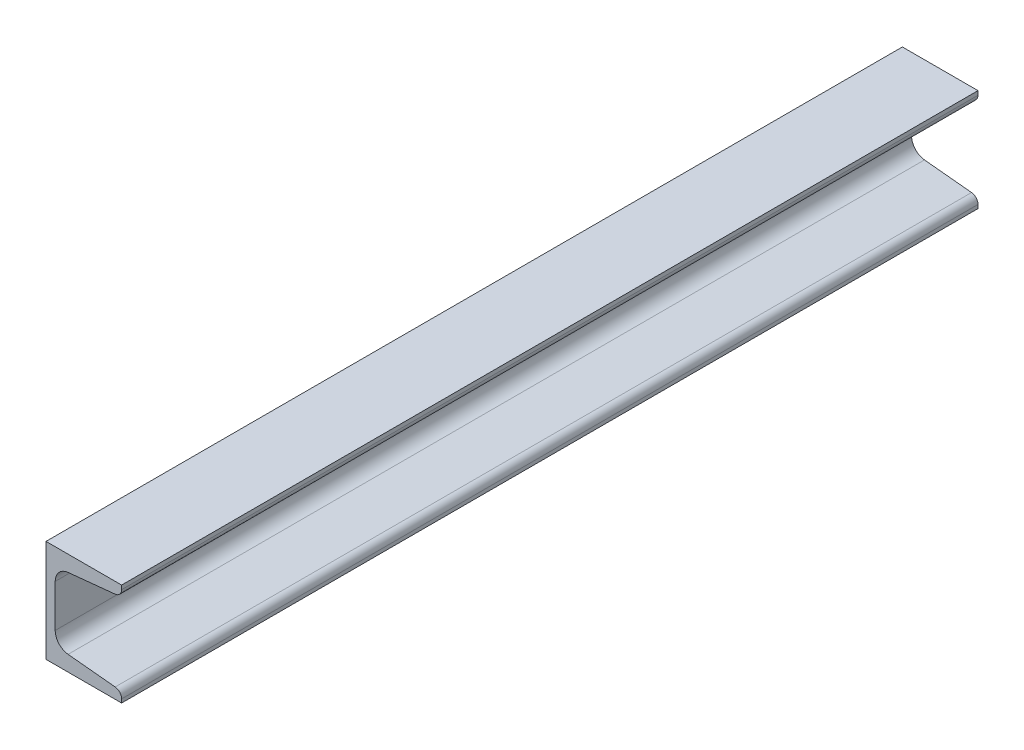
ISO-10303-21;
HEADER;
FILE_DESCRIPTION(('STEP AP214'),'2;1');
FILE_NAME('part.step','',(''),(''),'','','');
FILE_SCHEMA(('AUTOMOTIVE_DESIGN { 1 0 10303 214 1 1 1 1 }'));
ENDSEC;
DATA;
#1=APPLICATION_CONTEXT('core data for automotive mechanical design processes');
#2=APPLICATION_PROTOCOL_DEFINITION('international standard','automotive_design',2000,#1);
#3=PRODUCT_CONTEXT('',#1,'mechanical');
#4=PRODUCT('Part','Part','',(#3));
#5=PRODUCT_RELATED_PRODUCT_CATEGORY('part','',(#4));
#6=PRODUCT_DEFINITION_FORMATION('','',#4);
#7=PRODUCT_DEFINITION_CONTEXT('part definition',#1,'design');
#8=PRODUCT_DEFINITION('design','',#6,#7);
#9=PRODUCT_DEFINITION_SHAPE('','',#8);
#10=(LENGTH_UNIT() NAMED_UNIT(*) SI_UNIT(.MILLI.,.METRE.));
#11=(NAMED_UNIT(*) PLANE_ANGLE_UNIT() SI_UNIT($,.RADIAN.));
#12=(NAMED_UNIT(*) SI_UNIT($,.STERADIAN.) SOLID_ANGLE_UNIT());
#13=UNCERTAINTY_MEASURE_WITH_UNIT(LENGTH_MEASURE(1.E-05),#10,'distance_accuracy_value','');
#14=(GEOMETRIC_REPRESENTATION_CONTEXT(3) GLOBAL_UNCERTAINTY_ASSIGNED_CONTEXT((#13)) GLOBAL_UNIT_ASSIGNED_CONTEXT((#10,
#11,#12)) REPRESENTATION_CONTEXT('',''));
#15=CARTESIAN_POINT('',(0.,0.,0.));
#16=DIRECTION('',(0.,0.,1.));
#17=DIRECTION('',(1.,0.,0.));
#18=AXIS2_PLACEMENT_3D('',#15,#16,#17);
#19=CARTESIAN_POINT('',(0.,0.,419.));
#20=DIRECTION('',(0.,1.,0.));
#21=DIRECTION('',(0.,0.,1.));
#22=AXIS2_PLACEMENT_3D('',#19,#20,#21);
#23=PLANE('',#22);
#24=DIRECTION('',(1.,0.,0.));
#25=VECTOR('',#24,1.);
#26=CARTESIAN_POINT('',(0.,0.,0.));
#27=LINE('',#26,#25);
#28=CARTESIAN_POINT('',(0.,0.,0.));
#29=VERTEX_POINT('',#28);
#30=CARTESIAN_POINT('',(37.,0.,0.));
#31=VERTEX_POINT('',#30);
#32=EDGE_CURVE('E156',#29,#31,#27,.T.);
#33=ORIENTED_EDGE('',*,*,#32,.T.);
#34=DIRECTION('',(0.,0.,-1.));
#35=VECTOR('',#34,1.);
#36=CARTESIAN_POINT('',(37.,0.,419.));
#37=LINE('',#36,#35);
#38=CARTESIAN_POINT('',(37.,0.,419.));
#39=VERTEX_POINT('',#38);
#40=EDGE_CURVE('E11',#39,#31,#37,.T.);
#41=ORIENTED_EDGE('',*,*,#40,.F.);
#42=DIRECTION('',(1.,0.,0.));
#43=VECTOR('',#42,1.);
#44=CARTESIAN_POINT('',(0.,0.,419.));
#45=LINE('',#44,#43);
#46=CARTESIAN_POINT('',(0.,0.,419.));
#47=VERTEX_POINT('',#46);
#48=EDGE_CURVE('E178',#47,#39,#45,.T.);
#49=ORIENTED_EDGE('',*,*,#48,.F.);
#50=DIRECTION('',(0.,0.,-1.));
#51=VECTOR('',#50,1.);
#52=CARTESIAN_POINT('',(0.,0.,419.));
#53=LINE('',#52,#51);
#54=EDGE_CURVE('E152',#47,#29,#53,.T.);
#55=ORIENTED_EDGE('',*,*,#54,.T.);
#56=EDGE_LOOP('',(#33,#41,#49,#55));
#57=FACE_BOUND('',#56,.T.);
#58=ADVANCED_FACE('F36',(#57),#23,.F.);
#59=CARTESIAN_POINT('',(37.,0.,419.));
#60=DIRECTION('',(-1.,0.,0.));
#61=DIRECTION('',(0.,0.,1.));
#62=AXIS2_PLACEMENT_3D('',#59,#60,#61);
#63=PLANE('',#62);
#64=DIRECTION('',(0.,1.,0.));
#65=VECTOR('',#64,1.);
#66=CARTESIAN_POINT('',(37.,0.,0.));
#67=LINE('',#66,#65);
#68=CARTESIAN_POINT('',(37.,1.75754353260767,0.));
#69=VERTEX_POINT('',#68);
#70=EDGE_CURVE('E159',#31,#69,#67,.T.);
#71=ORIENTED_EDGE('',*,*,#70,.T.);
#72=DIRECTION('',(0.,0.,-1.));
#73=VECTOR('',#72,1.);
#74=CARTESIAN_POINT('',(37.,1.75754353260767,419.));
#75=LINE('',#74,#73);
#76=CARTESIAN_POINT('',(37.,1.75754353260767,419.));
#77=VERTEX_POINT('',#76);
#78=EDGE_CURVE('E44',#77,#69,#75,.T.);
#79=ORIENTED_EDGE('',*,*,#78,.F.);
#80=DIRECTION('',(0.,1.,0.));
#81=VECTOR('',#80,1.);
#82=CARTESIAN_POINT('',(37.,0.,419.));
#83=LINE('',#82,#81);
#84=EDGE_CURVE('E107',#39,#77,#83,.T.);
#85=ORIENTED_EDGE('',*,*,#84,.F.);
#86=ORIENTED_EDGE('',*,*,#40,.T.);
#87=EDGE_LOOP('',(#71,#79,#85,#86));
#88=FACE_BOUND('',#87,.T.);
#89=ADVANCED_FACE('F256',(#88),#63,.F.);
#90=CARTESIAN_POINT('',(33.5,1.75754353260769,419.));
#91=DIRECTION('',(0.,0.,-1.));
#92=DIRECTION('',(-1.,0.,0.));
#93=AXIS2_PLACEMENT_3D('',#90,#91,#92);
#94=CYLINDRICAL_SURFACE('',#93,3.5);
#95=CARTESIAN_POINT('',(33.5,1.75754353260769,0.));
#96=DIRECTION('',(0.,0.,1.));
#97=DIRECTION('',(1.,0.,0.));
#98=AXIS2_PLACEMENT_3D('',#95,#96,#97);
#99=CIRCLE('',#98,3.5);
#100=CARTESIAN_POINT('',(33.8482630165735,5.24017369834266,0.));
#101=VERTEX_POINT('',#100);
#102=EDGE_CURVE('E161',#69,#101,#99,.T.);
#103=ORIENTED_EDGE('',*,*,#102,.T.);
#104=DIRECTION('',(0.,0.,-1.));
#105=VECTOR('',#104,1.);
#106=CARTESIAN_POINT('',(33.8482630165735,5.24017369834266,419.));
#107=LINE('',#106,#105);
#108=CARTESIAN_POINT('',(33.8482630165735,5.24017369834266,419.));
#109=VERTEX_POINT('',#108);
#110=EDGE_CURVE('E197',#109,#101,#107,.T.);
#111=ORIENTED_EDGE('',*,*,#110,.F.);
#112=CARTESIAN_POINT('',(33.5,1.75754353260769,419.));
#113=DIRECTION('',(0.,0.,1.));
#114=DIRECTION('',(1.,0.,0.));
#115=AXIS2_PLACEMENT_3D('',#112,#113,#114);
#116=CIRCLE('',#115,3.5);
#117=EDGE_CURVE('E205',#77,#109,#116,.T.);
#118=ORIENTED_EDGE('',*,*,#117,.F.);
#119=ORIENTED_EDGE('',*,*,#78,.T.);
#120=EDGE_LOOP('',(#103,#111,#118,#119));
#121=FACE_BOUND('',#120,.T.);
#122=ADVANCED_FACE('F203',(#121),#94,.T.);
#123=CARTESIAN_POINT('',(10.8034739668531,7.5446526033147,419.));
#124=DIRECTION('',(-0.0995037190209989,-0.995037190209989,0.));
#125=DIRECTION('',(0.995037190209989,-0.0995037190209989,0.));
#126=AXIS2_PLACEMENT_3D('',#123,#124,#125);
#127=PLANE('',#126);
#128=DIRECTION('',(-0.995037190209989,0.0995037190209989,0.));
#129=VECTOR('',#128,1.);
#130=CARTESIAN_POINT('',(10.8034739668531,7.5446526033147,0.));
#131=LINE('',#130,#129);
#132=CARTESIAN_POINT('',(10.8034739668531,7.5446526033147,0.));
#133=VERTEX_POINT('',#132);
#134=EDGE_CURVE('E163',#101,#133,#131,.T.);
#135=ORIENTED_EDGE('',*,*,#134,.T.);
#136=DIRECTION('',(0.,0.,-1.));
#137=VECTOR('',#136,1.);
#138=CARTESIAN_POINT('',(10.8034739668531,7.5446526033147,419.));
#139=LINE('',#138,#137);
#140=CARTESIAN_POINT('',(10.8034739668531,7.5446526033147,419.));
#141=VERTEX_POINT('',#140);
#142=EDGE_CURVE('E194',#141,#133,#139,.T.);
#143=ORIENTED_EDGE('',*,*,#142,.F.);
#144=DIRECTION('',(-0.995037190209989,0.0995037190209989,0.));
#145=VECTOR('',#144,1.);
#146=CARTESIAN_POINT('',(10.8034739668531,7.5446526033147,419.));
#147=LINE('',#146,#145);
#148=EDGE_CURVE('E223',#109,#141,#147,.T.);
#149=ORIENTED_EDGE('',*,*,#148,.F.);
#150=ORIENTED_EDGE('',*,*,#110,.T.);
#151=EDGE_LOOP('',(#135,#143,#149,#150));
#152=FACE_BOUND('',#151,.T.);
#153=ADVANCED_FACE('F214',(#152),#127,.F.);
#154=CARTESIAN_POINT('',(11.5,14.5099129347846,419.));
#155=DIRECTION('',(0.,0.,-1.));
#156=DIRECTION('',(-1.,0.,0.));
#157=AXIS2_PLACEMENT_3D('',#154,#155,#156);
#158=CYLINDRICAL_SURFACE('',#157,7.);
#159=CARTESIAN_POINT('',(11.5,14.5099129347846,0.));
#160=DIRECTION('',(0.,0.,-1.));
#161=DIRECTION('',(1.,0.,0.));
#162=AXIS2_PLACEMENT_3D('',#159,#160,#161);
#163=CIRCLE('',#162,7.);
#164=CARTESIAN_POINT('',(4.5,14.5099129347847,0.));
#165=VERTEX_POINT('',#164);
#166=EDGE_CURVE('E165',#133,#165,#163,.T.);
#167=ORIENTED_EDGE('',*,*,#166,.T.);
#168=DIRECTION('',(0.,0.,-1.));
#169=VECTOR('',#168,1.);
#170=CARTESIAN_POINT('',(4.5,14.5099129347847,419.));
#171=LINE('',#170,#169);
#172=CARTESIAN_POINT('',(4.5,14.5099129347847,419.));
#173=VERTEX_POINT('',#172);
#174=EDGE_CURVE('E191',#173,#165,#171,.T.);
#175=ORIENTED_EDGE('',*,*,#174,.F.);
#176=CARTESIAN_POINT('',(11.5,14.5099129347846,419.));
#177=DIRECTION('',(0.,0.,-1.));
#178=DIRECTION('',(1.,0.,0.));
#179=AXIS2_PLACEMENT_3D('',#176,#177,#178);
#180=CIRCLE('',#179,7.);
#181=EDGE_CURVE('E220',#141,#173,#180,.T.);
#182=ORIENTED_EDGE('',*,*,#181,.F.);
#183=ORIENTED_EDGE('',*,*,#142,.T.);
#184=EDGE_LOOP('',(#167,#175,#182,#183));
#185=FACE_BOUND('',#184,.T.);
#186=ADVANCED_FACE('F218',(#185),#158,.F.);
#187=CARTESIAN_POINT('',(4.5,14.5099129347847,419.));
#188=DIRECTION('',(-1.,0.,0.));
#189=DIRECTION('',(0.,-1.,0.));
#190=AXIS2_PLACEMENT_3D('',#187,#188,#189);
#191=PLANE('',#190);
#192=DIRECTION('',(0.,1.,0.));
#193=VECTOR('',#192,1.);
#194=CARTESIAN_POINT('',(4.5,14.5099129347847,0.));
#195=LINE('',#194,#193);
#196=CARTESIAN_POINT('',(4.5,35.2876429963102,0.));
#197=VERTEX_POINT('',#196);
#198=EDGE_CURVE('E167',#165,#197,#195,.T.);
#199=ORIENTED_EDGE('',*,*,#198,.T.);
#200=DIRECTION('',(0.,0.,-1.));
#201=VECTOR('',#200,1.);
#202=CARTESIAN_POINT('',(4.5,35.2876429963102,419.));
#203=LINE('',#202,#201);
#204=CARTESIAN_POINT('',(4.5,35.2876429963102,419.));
#205=VERTEX_POINT('',#204);
#206=EDGE_CURVE('E188',#205,#197,#203,.T.);
#207=ORIENTED_EDGE('',*,*,#206,.F.);
#208=DIRECTION('',(0.,1.,0.));
#209=VECTOR('',#208,1.);
#210=CARTESIAN_POINT('',(4.5,14.5099129347847,419.));
#211=LINE('',#210,#209);
#212=EDGE_CURVE('E222',#173,#205,#211,.T.);
#213=ORIENTED_EDGE('',*,*,#212,.F.);
#214=ORIENTED_EDGE('',*,*,#174,.T.);
#215=EDGE_LOOP('',(#199,#207,#213,#214));
#216=FACE_BOUND('',#215,.T.);
#217=ADVANCED_FACE('F269',(#216),#191,.F.);
#218=CARTESIAN_POINT('',(11.5,35.2876429963103,419.));
#219=DIRECTION('',(0.,0.,-1.));
#220=DIRECTION('',(-1.,0.,0.));
#221=AXIS2_PLACEMENT_3D('',#218,#219,#220);
#222=CYLINDRICAL_SURFACE('',#221,7.);
#223=CARTESIAN_POINT('',(11.5,35.2876429963103,0.));
#224=DIRECTION('',(0.,0.,-1.));
#225=DIRECTION('',(1.,0.,0.));
#226=AXIS2_PLACEMENT_3D('',#223,#224,#225);
#227=CIRCLE('',#226,7.);
#228=CARTESIAN_POINT('',(10.803473966853,42.2529033277802,0.));
#229=VERTEX_POINT('',#228);
#230=EDGE_CURVE('E169',#197,#229,#227,.T.);
#231=ORIENTED_EDGE('',*,*,#230,.T.);
#232=DIRECTION('',(0.,0.,-1.));
#233=VECTOR('',#232,1.);
#234=CARTESIAN_POINT('',(10.803473966853,42.2529033277802,419.));
#235=LINE('',#234,#233);
#236=CARTESIAN_POINT('',(10.803473966853,42.2529033277802,419.));
#237=VERTEX_POINT('',#236);
#238=EDGE_CURVE('E185',#237,#229,#235,.T.);
#239=ORIENTED_EDGE('',*,*,#238,.F.);
#240=CARTESIAN_POINT('',(11.5,35.2876429963103,419.));
#241=DIRECTION('',(0.,0.,-1.));
#242=DIRECTION('',(1.,0.,0.));
#243=AXIS2_PLACEMENT_3D('',#240,#241,#242);
#244=CIRCLE('',#243,7.);
#245=EDGE_CURVE('E225',#205,#237,#244,.T.);
#246=ORIENTED_EDGE('',*,*,#245,.F.);
#247=ORIENTED_EDGE('',*,*,#206,.T.);
#248=EDGE_LOOP('',(#231,#239,#246,#247));
#249=FACE_BOUND('',#248,.T.);
#250=ADVANCED_FACE('F272',(#249),#222,.F.);
#251=CARTESIAN_POINT('',(10.803473966853,42.2529033277802,419.));
#252=DIRECTION('',(-0.0995037190209989,0.995037190209989,0.));
#253=DIRECTION('',(-0.995037190209989,-0.0995037190209989,0.));
#254=AXIS2_PLACEMENT_3D('',#251,#252,#253);
#255=PLANE('',#254);
#256=DIRECTION('',(0.995037190209989,0.0995037190209989,0.));
#257=VECTOR('',#256,1.);
#258=CARTESIAN_POINT('',(10.803473966853,42.2529033277802,0.));
#259=LINE('',#258,#257);
#260=CARTESIAN_POINT('',(33.8482630165735,44.5573822327522,0.));
#261=VERTEX_POINT('',#260);
#262=EDGE_CURVE('E171',#229,#261,#259,.T.);
#263=ORIENTED_EDGE('',*,*,#262,.T.);
#264=DIRECTION('',(0.,0.,-1.));
#265=VECTOR('',#264,1.);
#266=CARTESIAN_POINT('',(33.8482630165735,44.5573822327522,419.));
#267=LINE('',#266,#265);
#268=CARTESIAN_POINT('',(33.8482630165735,44.5573822327522,419.));
#269=VERTEX_POINT('',#268);
#270=EDGE_CURVE('E182',#269,#261,#267,.T.);
#271=ORIENTED_EDGE('',*,*,#270,.F.);
#272=DIRECTION('',(0.995037190209989,0.0995037190209989,0.));
#273=VECTOR('',#272,1.);
#274=CARTESIAN_POINT('',(10.803473966853,42.2529033277802,419.));
#275=LINE('',#274,#273);
#276=EDGE_CURVE('E231',#237,#269,#275,.T.);
#277=ORIENTED_EDGE('',*,*,#276,.F.);
#278=ORIENTED_EDGE('',*,*,#238,.T.);
#279=EDGE_LOOP('',(#263,#271,#277,#278));
#280=FACE_BOUND('',#279,.T.);
#281=ADVANCED_FACE('F237',(#280),#255,.F.);
#282=CARTESIAN_POINT('',(33.5,48.0400123984872,419.));
#283=DIRECTION('',(0.,0.,-1.));
#284=DIRECTION('',(-1.,0.,0.));
#285=AXIS2_PLACEMENT_3D('',#282,#283,#284);
#286=CYLINDRICAL_SURFACE('',#285,3.50000000000001);
#287=CARTESIAN_POINT('',(33.5,48.0400123984872,0.));
#288=DIRECTION('',(0.,0.,1.));
#289=DIRECTION('',(1.,0.,0.));
#290=AXIS2_PLACEMENT_3D('',#287,#288,#289);
#291=CIRCLE('',#290,3.50000000000001);
#292=CARTESIAN_POINT('',(37.,48.0400123984872,0.));
#293=VERTEX_POINT('',#292);
#294=EDGE_CURVE('E173',#261,#293,#291,.T.);
#295=ORIENTED_EDGE('',*,*,#294,.T.);
#296=DIRECTION('',(0.,0.,-1.));
#297=VECTOR('',#296,1.);
#298=CARTESIAN_POINT('',(37.,48.0400123984872,419.));
#299=LINE('',#298,#297);
#300=CARTESIAN_POINT('',(37.,48.0400123984872,419.));
#301=VERTEX_POINT('',#300);
#302=EDGE_CURVE('E147',#301,#293,#299,.T.);
#303=ORIENTED_EDGE('',*,*,#302,.F.);
#304=CARTESIAN_POINT('',(33.5,48.0400123984872,419.));
#305=DIRECTION('',(0.,0.,1.));
#306=DIRECTION('',(1.,0.,0.));
#307=AXIS2_PLACEMENT_3D('',#304,#305,#306);
#308=CIRCLE('',#307,3.50000000000001);
#309=EDGE_CURVE('E138',#269,#301,#308,.T.);
#310=ORIENTED_EDGE('',*,*,#309,.F.);
#311=ORIENTED_EDGE('',*,*,#270,.T.);
#312=EDGE_LOOP('',(#295,#303,#310,#311));
#313=FACE_BOUND('',#312,.T.);
#314=ADVANCED_FACE('F241',(#313),#286,.T.);
#315=CARTESIAN_POINT('',(37.,48.0400123984872,419.));
#316=DIRECTION('',(-1.,0.,0.));
#317=DIRECTION('',(0.,0.,1.));
#318=AXIS2_PLACEMENT_3D('',#315,#316,#317);
#319=PLANE('',#318);
#320=DIRECTION('',(0.,1.,0.));
#321=VECTOR('',#320,1.);
#322=CARTESIAN_POINT('',(37.,48.0400123984872,0.));
#323=LINE('',#322,#321);
#324=CARTESIAN_POINT('',(37.,50.,0.));
#325=VERTEX_POINT('',#324);
#326=EDGE_CURVE('E146',#293,#325,#323,.T.);
#327=ORIENTED_EDGE('',*,*,#326,.T.);
#328=DIRECTION('',(0.,0.,-1.));
#329=VECTOR('',#328,1.);
#330=CARTESIAN_POINT('',(37.,50.,419.));
#331=LINE('',#330,#329);
#332=CARTESIAN_POINT('',(37.,50.,419.));
#333=VERTEX_POINT('',#332);
#334=EDGE_CURVE('E143',#333,#325,#331,.T.);
#335=ORIENTED_EDGE('',*,*,#334,.F.);
#336=DIRECTION('',(0.,1.,0.));
#337=VECTOR('',#336,1.);
#338=CARTESIAN_POINT('',(37.,48.0400123984872,419.));
#339=LINE('',#338,#337);
#340=EDGE_CURVE('E132',#301,#333,#339,.T.);
#341=ORIENTED_EDGE('',*,*,#340,.F.);
#342=ORIENTED_EDGE('',*,*,#302,.T.);
#343=EDGE_LOOP('',(#327,#335,#341,#342));
#344=FACE_BOUND('',#343,.T.);
#345=ADVANCED_FACE('F144',(#344),#319,.F.);
#346=CARTESIAN_POINT('',(-1.71512449944288E-13,50.,419.));
#347=DIRECTION('',(0.,-1.,0.));
#348=DIRECTION('',(0.,0.,-1.));
#349=AXIS2_PLACEMENT_3D('',#346,#347,#348);
#350=PLANE('',#349);
#351=DIRECTION('',(-1.,0.,0.));
#352=VECTOR('',#351,1.);
#353=CARTESIAN_POINT('',(-1.71512449944288E-13,50.,0.));
#354=LINE('',#353,#352);
#355=CARTESIAN_POINT('',(-1.71512449944288E-13,50.,0.));
#356=VERTEX_POINT('',#355);
#357=EDGE_CURVE('E93',#325,#356,#354,.T.);
#358=ORIENTED_EDGE('',*,*,#357,.T.);
#359=DIRECTION('',(0.,0.,-1.));
#360=VECTOR('',#359,1.);
#361=CARTESIAN_POINT('',(-1.71512449944288E-13,50.,419.));
#362=LINE('',#361,#360);
#363=CARTESIAN_POINT('',(-1.71512449944288E-13,50.,419.));
#364=VERTEX_POINT('',#363);
#365=EDGE_CURVE('E148',#364,#356,#362,.T.);
#366=ORIENTED_EDGE('',*,*,#365,.F.);
#367=DIRECTION('',(-1.,0.,0.));
#368=VECTOR('',#367,1.);
#369=CARTESIAN_POINT('',(-1.71512449944288E-13,50.,419.));
#370=LINE('',#369,#368);
#371=EDGE_CURVE('E136',#333,#364,#370,.T.);
#372=ORIENTED_EDGE('',*,*,#371,.F.);
#373=ORIENTED_EDGE('',*,*,#334,.T.);
#374=EDGE_LOOP('',(#358,#366,#372,#373));
#375=FACE_BOUND('',#374,.T.);
#376=ADVANCED_FACE('F150',(#375),#350,.F.);
#377=CARTESIAN_POINT('',(0.,0.,419.));
#378=DIRECTION('',(1.,0.,0.));
#379=DIRECTION('',(0.,1.,0.));
#380=AXIS2_PLACEMENT_3D('',#377,#378,#379);
#381=PLANE('',#380);
#382=DIRECTION('',(0.,-1.,0.));
#383=VECTOR('',#382,1.);
#384=CARTESIAN_POINT('',(0.,0.,0.));
#385=LINE('',#384,#383);
#386=EDGE_CURVE('E99',#356,#29,#385,.T.);
#387=ORIENTED_EDGE('',*,*,#386,.T.);
#388=ORIENTED_EDGE('',*,*,#54,.F.);
#389=DIRECTION('',(0.,-1.,0.));
#390=VECTOR('',#389,1.);
#391=CARTESIAN_POINT('',(0.,0.,419.));
#392=LINE('',#391,#390);
#393=EDGE_CURVE('E52',#364,#47,#392,.T.);
#394=ORIENTED_EDGE('',*,*,#393,.F.);
#395=ORIENTED_EDGE('',*,*,#365,.T.);
#396=EDGE_LOOP('',(#387,#388,#394,#395));
#397=FACE_BOUND('',#396,.T.);
#398=ADVANCED_FACE('F245',(#397),#381,.F.);
#399=CARTESIAN_POINT('',(33.5,1.75754353260769,419.));
#400=DIRECTION('',(0.,0.,1.));
#401=DIRECTION('',(1.,0.,0.));
#402=AXIS2_PLACEMENT_3D('',#399,#400,#401);
#403=PLANE('',#402);
#404=ORIENTED_EDGE('',*,*,#48,.T.);
#405=ORIENTED_EDGE('',*,*,#84,.T.);
#406=ORIENTED_EDGE('',*,*,#117,.T.);
#407=ORIENTED_EDGE('',*,*,#148,.T.);
#408=ORIENTED_EDGE('',*,*,#181,.T.);
#409=ORIENTED_EDGE('',*,*,#212,.T.);
#410=ORIENTED_EDGE('',*,*,#245,.T.);
#411=ORIENTED_EDGE('',*,*,#276,.T.);
#412=ORIENTED_EDGE('',*,*,#309,.T.);
#413=ORIENTED_EDGE('',*,*,#340,.T.);
#414=ORIENTED_EDGE('',*,*,#371,.T.);
#415=ORIENTED_EDGE('',*,*,#393,.T.);
#416=EDGE_LOOP('',(#404,#405,#406,#407,#408,#409,#410,#411,#412,#413,#414,#415));
#417=FACE_BOUND('',#416,.T.);
#418=ADVANCED_FACE('F134',(#417),#403,.T.);
#419=CARTESIAN_POINT('',(33.5,1.75754353260769,0.));
#420=DIRECTION('',(0.,0.,1.));
#421=DIRECTION('',(1.,0.,0.));
#422=AXIS2_PLACEMENT_3D('',#419,#420,#421);
#423=PLANE('',#422);
#424=ORIENTED_EDGE('',*,*,#32,.F.);
#425=ORIENTED_EDGE('',*,*,#386,.F.);
#426=ORIENTED_EDGE('',*,*,#357,.F.);
#427=ORIENTED_EDGE('',*,*,#326,.F.);
#428=ORIENTED_EDGE('',*,*,#294,.F.);
#429=ORIENTED_EDGE('',*,*,#262,.F.);
#430=ORIENTED_EDGE('',*,*,#230,.F.);
#431=ORIENTED_EDGE('',*,*,#198,.F.);
#432=ORIENTED_EDGE('',*,*,#166,.F.);
#433=ORIENTED_EDGE('',*,*,#134,.F.);
#434=ORIENTED_EDGE('',*,*,#102,.F.);
#435=ORIENTED_EDGE('',*,*,#70,.F.);
#436=EDGE_LOOP('',(#424,#425,#426,#427,#428,#429,#430,#431,#432,#433,#434,#435));
#437=FACE_BOUND('',#436,.T.);
#438=ADVANCED_FACE('F209',(#437),#423,.F.);
#439=CLOSED_SHELL('',(#58,#89,#122,#153,#186,#217,#250,#281,#314,#345,#376,#398,#418,#438));
#440=MANIFOLD_SOLID_BREP('B2',#439);
#441=ADVANCED_BREP_SHAPE_REPRESENTATION('',(#18,#440),#14);
#442=SHAPE_DEFINITION_REPRESENTATION(#9,#441);
ENDSEC;
END-ISO-10303-21;
